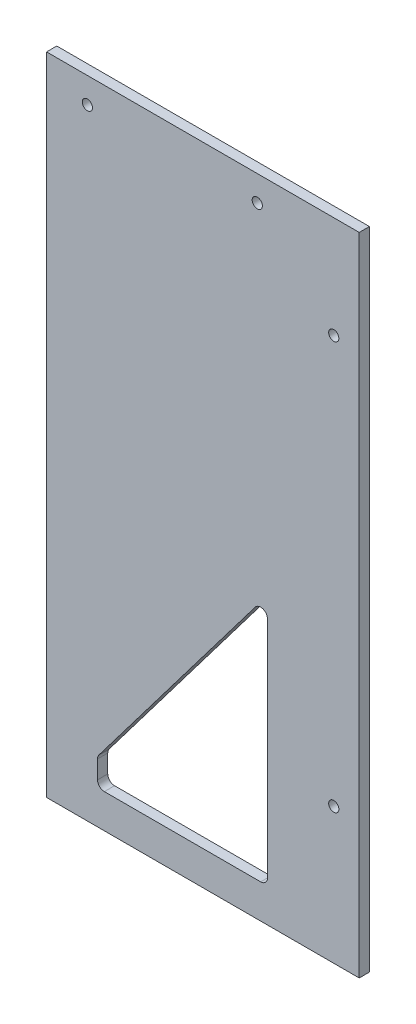
ISO-10303-21;
HEADER;
FILE_DESCRIPTION(('STEP AP214'),'2;1');
FILE_NAME('part.step','',(''),(''),'','','');
FILE_SCHEMA(('AUTOMOTIVE_DESIGN { 1 0 10303 214 1 1 1 1 }'));
ENDSEC;
DATA;
#1=APPLICATION_CONTEXT('core data for automotive mechanical design processes');
#2=APPLICATION_PROTOCOL_DEFINITION('international standard','automotive_design',2000,#1);
#3=PRODUCT_CONTEXT('',#1,'mechanical');
#4=PRODUCT('Part','Part','',(#3));
#5=PRODUCT_RELATED_PRODUCT_CATEGORY('part','',(#4));
#6=PRODUCT_DEFINITION_FORMATION('','',#4);
#7=PRODUCT_DEFINITION_CONTEXT('part definition',#1,'design');
#8=PRODUCT_DEFINITION('design','',#6,#7);
#9=PRODUCT_DEFINITION_SHAPE('','',#8);
#10=(LENGTH_UNIT() NAMED_UNIT(*) SI_UNIT(.MILLI.,.METRE.));
#11=(NAMED_UNIT(*) PLANE_ANGLE_UNIT() SI_UNIT($,.RADIAN.));
#12=(NAMED_UNIT(*) SI_UNIT($,.STERADIAN.) SOLID_ANGLE_UNIT());
#13=UNCERTAINTY_MEASURE_WITH_UNIT(LENGTH_MEASURE(1.E-05),#10,'distance_accuracy_value','');
#14=(GEOMETRIC_REPRESENTATION_CONTEXT(3) GLOBAL_UNCERTAINTY_ASSIGNED_CONTEXT((#13)) GLOBAL_UNIT_ASSIGNED_CONTEXT((#10,
#11,#12)) REPRESENTATION_CONTEXT('',''));
#15=CARTESIAN_POINT('',(0.,0.,0.));
#16=DIRECTION('',(0.,0.,1.));
#17=DIRECTION('',(1.,0.,0.));
#18=AXIS2_PLACEMENT_3D('',#15,#16,#17);
#19=CARTESIAN_POINT('',(0.,0.,3.));
#20=DIRECTION('',(0.,0.,1.));
#21=DIRECTION('',(1.,0.,0.));
#22=AXIS2_PLACEMENT_3D('',#19,#20,#21);
#23=PLANE('',#22);
#24=CARTESIAN_POINT('',(-34.,87.5,3.));
#25=DIRECTION('',(0.,0.,1.));
#26=DIRECTION('',(1.,0.,0.));
#27=AXIS2_PLACEMENT_3D('',#24,#25,#26);
#28=CIRCLE('',#27,1.5);
#29=CARTESIAN_POINT('',(-32.5,87.5,3.));
#30=VERTEX_POINT('',#29);
#31=EDGE_CURVE('E283',#30,#30,#28,.T.);
#32=ORIENTED_EDGE('',*,*,#31,.F.);
#33=EDGE_LOOP('',(#32));
#34=FACE_BOUND('',#33,.T.);
#35=CARTESIAN_POINT('',(16.,87.5,3.));
#36=DIRECTION('',(0.,0.,1.));
#37=DIRECTION('',(1.,0.,0.));
#38=AXIS2_PLACEMENT_3D('',#35,#36,#37);
#39=CIRCLE('',#38,1.5);
#40=CARTESIAN_POINT('',(17.5,87.5,3.));
#41=VERTEX_POINT('',#40);
#42=EDGE_CURVE('E291',#41,#41,#39,.T.);
#43=ORIENTED_EDGE('',*,*,#42,.F.);
#44=EDGE_LOOP('',(#43));
#45=FACE_BOUND('',#44,.T.);
#46=CARTESIAN_POINT('',(38.5,65.,3.));
#47=DIRECTION('',(0.,0.,1.));
#48=DIRECTION('',(1.,0.,0.));
#49=AXIS2_PLACEMENT_3D('',#46,#47,#48);
#50=CIRCLE('',#49,1.5);
#51=CARTESIAN_POINT('',(40.,65.,3.));
#52=VERTEX_POINT('',#51);
#53=EDGE_CURVE('E299',#52,#52,#50,.T.);
#54=ORIENTED_EDGE('',*,*,#53,.F.);
#55=EDGE_LOOP('',(#54));
#56=FACE_BOUND('',#55,.T.);
#57=CARTESIAN_POINT('',(38.5,-55.,3.));
#58=DIRECTION('',(0.,0.,1.));
#59=DIRECTION('',(1.,0.,0.));
#60=AXIS2_PLACEMENT_3D('',#57,#58,#59);
#61=CIRCLE('',#60,1.5);
#62=CARTESIAN_POINT('',(40.,-55.,3.));
#63=VERTEX_POINT('',#62);
#64=EDGE_CURVE('E253',#63,#63,#61,.T.);
#65=ORIENTED_EDGE('',*,*,#64,.F.);
#66=EDGE_LOOP('',(#65));
#67=FACE_BOUND('',#66,.T.);
#68=DIRECTION('',(0.,1.,0.));
#69=VECTOR('',#68,1.);
#70=CARTESIAN_POINT('',(46.,95.,3.));
#71=LINE('',#70,#69);
#72=CARTESIAN_POINT('',(46.,-95.,3.));
#73=VERTEX_POINT('',#72);
#74=CARTESIAN_POINT('',(46.,95.,3.));
#75=VERTEX_POINT('',#74);
#76=EDGE_CURVE('E153',#73,#75,#71,.T.);
#77=ORIENTED_EDGE('',*,*,#76,.T.);
#78=DIRECTION('',(-1.,0.,0.));
#79=VECTOR('',#78,1.);
#80=CARTESIAN_POINT('',(-46.,95.,3.));
#81=LINE('',#80,#79);
#82=CARTESIAN_POINT('',(-46.,95.,3.));
#83=VERTEX_POINT('',#82);
#84=EDGE_CURVE('E141',#75,#83,#81,.T.);
#85=ORIENTED_EDGE('',*,*,#84,.T.);
#86=DIRECTION('',(0.,-1.,0.));
#87=VECTOR('',#86,1.);
#88=CARTESIAN_POINT('',(-46.,95.,3.));
#89=LINE('',#88,#87);
#90=CARTESIAN_POINT('',(-46.,-95.,3.));
#91=VERTEX_POINT('',#90);
#92=EDGE_CURVE('E152',#83,#91,#89,.T.);
#93=ORIENTED_EDGE('',*,*,#92,.T.);
#94=DIRECTION('',(1.,0.,0.));
#95=VECTOR('',#94,1.);
#96=CARTESIAN_POINT('',(-46.,-95.,3.));
#97=LINE('',#96,#95);
#98=EDGE_CURVE('E158',#91,#73,#97,.T.);
#99=ORIENTED_EDGE('',*,*,#98,.T.);
#100=EDGE_LOOP('',(#77,#85,#93,#99));
#101=FACE_BOUND('',#100,.T.);
#102=DIRECTION('',(0.,-1.,0.));
#103=VECTOR('',#102,1.);
#104=CARTESIAN_POINT('',(-31.,0.,3.));
#105=LINE('',#104,#103);
#106=CARTESIAN_POINT('',(-31.,-77.6723841817379,3.));
#107=VERTEX_POINT('',#106);
#108=CARTESIAN_POINT('',(-31.,-83.,3.));
#109=VERTEX_POINT('',#108);
#110=EDGE_CURVE('E269',#107,#109,#105,.T.);
#111=ORIENTED_EDGE('',*,*,#110,.F.);
#112=CARTESIAN_POINT('',(-29.,-77.6723841817379,3.));
#113=DIRECTION('',(0.,0.,1.));
#114=DIRECTION('',(1.,0.,0.));
#115=AXIS2_PLACEMENT_3D('',#112,#113,#114);
#116=CIRCLE('',#115,2.);
#117=CARTESIAN_POINT('',(-30.593809269054,-76.4641739293905,3.));
#118=VERTEX_POINT('',#117);
#119=EDGE_CURVE('E221',#107,#118,#116,.F.);
#120=ORIENTED_EDGE('',*,*,#119,.T.);
#121=DIRECTION('',(0.60410512617371,0.796904634527022,0.));
#122=VECTOR('',#121,1.);
#123=CARTESIAN_POINT('',(17.3821245663307,-13.1767718486701,3.));
#124=LINE('',#123,#122);
#125=CARTESIAN_POINT('',(15.3997722880698,-15.7917897476526,3.));
#126=VERTEX_POINT('',#125);
#127=EDGE_CURVE('E265',#118,#126,#124,.T.);
#128=ORIENTED_EDGE('',*,*,#127,.T.);
#129=CARTESIAN_POINT('',(16.9935815571238,-17.,3.));
#130=DIRECTION('',(0.,0.,1.));
#131=DIRECTION('',(1.,0.,0.));
#132=AXIS2_PLACEMENT_3D('',#129,#130,#131);
#133=CIRCLE('',#132,2.);
#134=CARTESIAN_POINT('',(16.9935815571238,-15.,3.));
#135=VERTEX_POINT('',#134);
#136=EDGE_CURVE('E227',#126,#135,#133,.F.);
#137=ORIENTED_EDGE('',*,*,#136,.T.);
#138=DIRECTION('',(1.,0.,0.));
#139=VECTOR('',#138,1.);
#140=CARTESIAN_POINT('',(0.,-15.,3.));
#141=LINE('',#140,#139);
#142=CARTESIAN_POINT('',(17.,-15.,3.));
#143=VERTEX_POINT('',#142);
#144=EDGE_CURVE('E238',#135,#143,#141,.T.);
#145=ORIENTED_EDGE('',*,*,#144,.T.);
#146=CARTESIAN_POINT('',(17.,-17.,3.));
#147=DIRECTION('',(0.,0.,1.));
#148=DIRECTION('',(1.,0.,0.));
#149=AXIS2_PLACEMENT_3D('',#146,#147,#148);
#150=CIRCLE('',#149,2.);
#151=CARTESIAN_POINT('',(19.,-17.,3.));
#152=VERTEX_POINT('',#151);
#153=EDGE_CURVE('E48',#143,#152,#150,.F.);
#154=ORIENTED_EDGE('',*,*,#153,.T.);
#155=DIRECTION('',(0.,-1.,0.));
#156=VECTOR('',#155,1.);
#157=CARTESIAN_POINT('',(19.,0.,3.));
#158=LINE('',#157,#156);
#159=CARTESIAN_POINT('',(19.,-83.,3.));
#160=VERTEX_POINT('',#159);
#161=EDGE_CURVE('E237',#152,#160,#158,.T.);
#162=ORIENTED_EDGE('',*,*,#161,.T.);
#163=CARTESIAN_POINT('',(17.,-83.,3.));
#164=DIRECTION('',(0.,0.,1.));
#165=DIRECTION('',(1.,0.,0.));
#166=AXIS2_PLACEMENT_3D('',#163,#164,#165);
#167=CIRCLE('',#166,2.);
#168=CARTESIAN_POINT('',(17.,-85.,3.));
#169=VERTEX_POINT('',#168);
#170=EDGE_CURVE('E209',#160,#169,#167,.F.);
#171=ORIENTED_EDGE('',*,*,#170,.T.);
#172=DIRECTION('',(1.,0.,0.));
#173=VECTOR('',#172,1.);
#174=CARTESIAN_POINT('',(0.,-85.,3.));
#175=LINE('',#174,#173);
#176=CARTESIAN_POINT('',(-29.,-85.,3.));
#177=VERTEX_POINT('',#176);
#178=EDGE_CURVE('E247',#177,#169,#175,.T.);
#179=ORIENTED_EDGE('',*,*,#178,.F.);
#180=CARTESIAN_POINT('',(-29.,-83.,3.));
#181=DIRECTION('',(0.,0.,1.));
#182=DIRECTION('',(1.,0.,0.));
#183=AXIS2_PLACEMENT_3D('',#180,#181,#182);
#184=CIRCLE('',#183,2.);
#185=EDGE_CURVE('E215',#177,#109,#184,.F.);
#186=ORIENTED_EDGE('',*,*,#185,.T.);
#187=EDGE_LOOP('',(#111,#120,#128,#137,#145,#154,#162,#171,#179,#186));
#188=FACE_BOUND('',#187,.T.);
#189=ADVANCED_FACE('F39',(#34,#45,#56,#67,#101,#188),#23,.T.);
#190=CARTESIAN_POINT('',(0.,0.,0.));
#191=DIRECTION('',(0.,0.,1.));
#192=DIRECTION('',(1.,0.,0.));
#193=AXIS2_PLACEMENT_3D('',#190,#191,#192);
#194=PLANE('',#193);
#195=DIRECTION('',(0.,1.,0.));
#196=VECTOR('',#195,1.);
#197=CARTESIAN_POINT('',(46.,95.,0.));
#198=LINE('',#197,#196);
#199=CARTESIAN_POINT('',(46.,-95.,0.));
#200=VERTEX_POINT('',#199);
#201=CARTESIAN_POINT('',(46.,95.,0.));
#202=VERTEX_POINT('',#201);
#203=EDGE_CURVE('E167',#200,#202,#198,.T.);
#204=ORIENTED_EDGE('',*,*,#203,.F.);
#205=DIRECTION('',(1.,0.,0.));
#206=VECTOR('',#205,1.);
#207=CARTESIAN_POINT('',(-46.,-95.,0.));
#208=LINE('',#207,#206);
#209=CARTESIAN_POINT('',(-46.,-95.,0.));
#210=VERTEX_POINT('',#209);
#211=EDGE_CURVE('E163',#210,#200,#208,.T.);
#212=ORIENTED_EDGE('',*,*,#211,.F.);
#213=DIRECTION('',(0.,-1.,0.));
#214=VECTOR('',#213,1.);
#215=CARTESIAN_POINT('',(-46.,95.,0.));
#216=LINE('',#215,#214);
#217=CARTESIAN_POINT('',(-46.,95.,0.));
#218=VERTEX_POINT('',#217);
#219=EDGE_CURVE('E316',#218,#210,#216,.T.);
#220=ORIENTED_EDGE('',*,*,#219,.F.);
#221=DIRECTION('',(-1.,0.,0.));
#222=VECTOR('',#221,1.);
#223=CARTESIAN_POINT('',(-46.,95.,0.));
#224=LINE('',#223,#222);
#225=EDGE_CURVE('E313',#202,#218,#224,.T.);
#226=ORIENTED_EDGE('',*,*,#225,.F.);
#227=EDGE_LOOP('',(#204,#212,#220,#226));
#228=FACE_BOUND('',#227,.T.);
#229=CARTESIAN_POINT('',(38.5,-55.,0.));
#230=DIRECTION('',(0.,0.,1.));
#231=DIRECTION('',(1.,0.,0.));
#232=AXIS2_PLACEMENT_3D('',#229,#230,#231);
#233=CIRCLE('',#232,1.5);
#234=CARTESIAN_POINT('',(40.,-55.,0.));
#235=VERTEX_POINT('',#234);
#236=EDGE_CURVE('E259',#235,#235,#233,.T.);
#237=ORIENTED_EDGE('',*,*,#236,.T.);
#238=EDGE_LOOP('',(#237));
#239=FACE_BOUND('',#238,.T.);
#240=CARTESIAN_POINT('',(38.5,65.,0.));
#241=DIRECTION('',(0.,0.,1.));
#242=DIRECTION('',(1.,0.,0.));
#243=AXIS2_PLACEMENT_3D('',#240,#241,#242);
#244=CIRCLE('',#243,1.5);
#245=CARTESIAN_POINT('',(40.,65.,0.));
#246=VERTEX_POINT('',#245);
#247=EDGE_CURVE('E295',#246,#246,#244,.T.);
#248=ORIENTED_EDGE('',*,*,#247,.T.);
#249=EDGE_LOOP('',(#248));
#250=FACE_BOUND('',#249,.T.);
#251=CARTESIAN_POINT('',(16.,87.5,0.));
#252=DIRECTION('',(0.,0.,1.));
#253=DIRECTION('',(1.,0.,0.));
#254=AXIS2_PLACEMENT_3D('',#251,#252,#253);
#255=CIRCLE('',#254,1.5);
#256=CARTESIAN_POINT('',(17.5,87.5,0.));
#257=VERTEX_POINT('',#256);
#258=EDGE_CURVE('E287',#257,#257,#255,.T.);
#259=ORIENTED_EDGE('',*,*,#258,.T.);
#260=EDGE_LOOP('',(#259));
#261=FACE_BOUND('',#260,.T.);
#262=CARTESIAN_POINT('',(-34.,87.5,0.));
#263=DIRECTION('',(0.,0.,1.));
#264=DIRECTION('',(1.,0.,0.));
#265=AXIS2_PLACEMENT_3D('',#262,#263,#264);
#266=CIRCLE('',#265,1.5);
#267=CARTESIAN_POINT('',(-32.5,87.5,0.));
#268=VERTEX_POINT('',#267);
#269=EDGE_CURVE('E279',#268,#268,#266,.T.);
#270=ORIENTED_EDGE('',*,*,#269,.T.);
#271=EDGE_LOOP('',(#270));
#272=FACE_BOUND('',#271,.T.);
#273=DIRECTION('',(0.60410512617371,0.796904634527022,0.));
#274=VECTOR('',#273,1.);
#275=CARTESIAN_POINT('',(17.3821245663307,-13.1767718486701,0.));
#276=LINE('',#275,#274);
#277=CARTESIAN_POINT('',(-30.593809269054,-76.4641739293905,0.));
#278=VERTEX_POINT('',#277);
#279=CARTESIAN_POINT('',(15.3997722880698,-15.7917897476526,0.));
#280=VERTEX_POINT('',#279);
#281=EDGE_CURVE('E278',#278,#280,#276,.T.);
#282=ORIENTED_EDGE('',*,*,#281,.F.);
#283=CARTESIAN_POINT('',(-29.,-77.6723841817379,0.));
#284=DIRECTION('',(0.,0.,1.));
#285=DIRECTION('',(1.,0.,0.));
#286=AXIS2_PLACEMENT_3D('',#283,#284,#285);
#287=CIRCLE('',#286,2.);
#288=CARTESIAN_POINT('',(-31.,-77.6723841817379,0.));
#289=VERTEX_POINT('',#288);
#290=EDGE_CURVE('E224',#278,#289,#287,.T.);
#291=ORIENTED_EDGE('',*,*,#290,.T.);
#292=DIRECTION('',(0.,-1.,0.));
#293=VECTOR('',#292,1.);
#294=CARTESIAN_POINT('',(-31.,0.,0.));
#295=LINE('',#294,#293);
#296=CARTESIAN_POINT('',(-31.,-83.,0.));
#297=VERTEX_POINT('',#296);
#298=EDGE_CURVE('E524',#289,#297,#295,.T.);
#299=ORIENTED_EDGE('',*,*,#298,.T.);
#300=CARTESIAN_POINT('',(-29.,-83.,0.));
#301=DIRECTION('',(0.,0.,1.));
#302=DIRECTION('',(1.,0.,0.));
#303=AXIS2_PLACEMENT_3D('',#300,#301,#302);
#304=CIRCLE('',#303,2.);
#305=CARTESIAN_POINT('',(-29.,-85.,0.));
#306=VERTEX_POINT('',#305);
#307=EDGE_CURVE('E218',#297,#306,#304,.T.);
#308=ORIENTED_EDGE('',*,*,#307,.T.);
#309=DIRECTION('',(1.,0.,0.));
#310=VECTOR('',#309,1.);
#311=CARTESIAN_POINT('',(0.,-85.,0.));
#312=LINE('',#311,#310);
#313=CARTESIAN_POINT('',(17.,-85.,0.));
#314=VERTEX_POINT('',#313);
#315=EDGE_CURVE('E261',#306,#314,#312,.T.);
#316=ORIENTED_EDGE('',*,*,#315,.T.);
#317=CARTESIAN_POINT('',(17.,-83.,0.));
#318=DIRECTION('',(0.,0.,1.));
#319=DIRECTION('',(1.,0.,0.));
#320=AXIS2_PLACEMENT_3D('',#317,#318,#319);
#321=CIRCLE('',#320,2.);
#322=CARTESIAN_POINT('',(19.,-83.,0.));
#323=VERTEX_POINT('',#322);
#324=EDGE_CURVE('E212',#314,#323,#321,.T.);
#325=ORIENTED_EDGE('',*,*,#324,.T.);
#326=DIRECTION('',(0.,-1.,0.));
#327=VECTOR('',#326,1.);
#328=CARTESIAN_POINT('',(19.,0.,0.));
#329=LINE('',#328,#327);
#330=CARTESIAN_POINT('',(19.,-17.,0.));
#331=VERTEX_POINT('',#330);
#332=EDGE_CURVE('E254',#331,#323,#329,.T.);
#333=ORIENTED_EDGE('',*,*,#332,.F.);
#334=CARTESIAN_POINT('',(17.,-17.,0.));
#335=DIRECTION('',(0.,0.,1.));
#336=DIRECTION('',(1.,0.,0.));
#337=AXIS2_PLACEMENT_3D('',#334,#335,#336);
#338=CIRCLE('',#337,2.);
#339=CARTESIAN_POINT('',(17.,-15.,0.));
#340=VERTEX_POINT('',#339);
#341=EDGE_CURVE('E11',#331,#340,#338,.T.);
#342=ORIENTED_EDGE('',*,*,#341,.T.);
#343=DIRECTION('',(1.,0.,0.));
#344=VECTOR('',#343,1.);
#345=CARTESIAN_POINT('',(0.,-15.,0.));
#346=LINE('',#345,#344);
#347=CARTESIAN_POINT('',(16.9935815571238,-15.,0.));
#348=VERTEX_POINT('',#347);
#349=EDGE_CURVE('E250',#348,#340,#346,.T.);
#350=ORIENTED_EDGE('',*,*,#349,.F.);
#351=CARTESIAN_POINT('',(16.9935815571238,-17.,0.));
#352=DIRECTION('',(0.,0.,1.));
#353=DIRECTION('',(1.,0.,0.));
#354=AXIS2_PLACEMENT_3D('',#351,#352,#353);
#355=CIRCLE('',#354,2.);
#356=EDGE_CURVE('E230',#348,#280,#355,.T.);
#357=ORIENTED_EDGE('',*,*,#356,.T.);
#358=EDGE_LOOP('',(#282,#291,#299,#308,#316,#325,#333,#342,#350,#357));
#359=FACE_BOUND('',#358,.T.);
#360=ADVANCED_FACE('F331',(#228,#239,#250,#261,#272,#359),#194,.F.);
#361=CARTESIAN_POINT('',(46.,95.,3.));
#362=DIRECTION('',(-1.,0.,0.));
#363=DIRECTION('',(0.,-1.,0.));
#364=AXIS2_PLACEMENT_3D('',#361,#362,#363);
#365=PLANE('',#364);
#366=ORIENTED_EDGE('',*,*,#203,.T.);
#367=DIRECTION('',(0.,0.,-1.));
#368=VECTOR('',#367,1.);
#369=CARTESIAN_POINT('',(46.,95.,3.));
#370=LINE('',#369,#368);
#371=EDGE_CURVE('E145',#75,#202,#370,.T.);
#372=ORIENTED_EDGE('',*,*,#371,.F.);
#373=ORIENTED_EDGE('',*,*,#76,.F.);
#374=DIRECTION('',(0.,0.,-1.));
#375=VECTOR('',#374,1.);
#376=CARTESIAN_POINT('',(46.,-95.,3.));
#377=LINE('',#376,#375);
#378=EDGE_CURVE('E310',#73,#200,#377,.T.);
#379=ORIENTED_EDGE('',*,*,#378,.T.);
#380=EDGE_LOOP('',(#366,#372,#373,#379));
#381=FACE_BOUND('',#380,.T.);
#382=ADVANCED_FACE('F165',(#381),#365,.F.);
#383=CARTESIAN_POINT('',(-46.,95.,3.));
#384=DIRECTION('',(0.,-1.,0.));
#385=DIRECTION('',(0.,0.,-1.));
#386=AXIS2_PLACEMENT_3D('',#383,#384,#385);
#387=PLANE('',#386);
#388=ORIENTED_EDGE('',*,*,#225,.T.);
#389=DIRECTION('',(0.,0.,-1.));
#390=VECTOR('',#389,1.);
#391=CARTESIAN_POINT('',(-46.,95.,3.));
#392=LINE('',#391,#390);
#393=EDGE_CURVE('E148',#83,#218,#392,.T.);
#394=ORIENTED_EDGE('',*,*,#393,.F.);
#395=ORIENTED_EDGE('',*,*,#84,.F.);
#396=ORIENTED_EDGE('',*,*,#371,.T.);
#397=EDGE_LOOP('',(#388,#394,#395,#396));
#398=FACE_BOUND('',#397,.T.);
#399=ADVANCED_FACE('F143',(#398),#387,.F.);
#400=CARTESIAN_POINT('',(-46.,95.,3.));
#401=DIRECTION('',(1.,0.,0.));
#402=DIRECTION('',(0.,1.,0.));
#403=AXIS2_PLACEMENT_3D('',#400,#401,#402);
#404=PLANE('',#403);
#405=ORIENTED_EDGE('',*,*,#219,.T.);
#406=DIRECTION('',(0.,0.,-1.));
#407=VECTOR('',#406,1.);
#408=CARTESIAN_POINT('',(-46.,-95.,3.));
#409=LINE('',#408,#407);
#410=EDGE_CURVE('E175',#91,#210,#409,.T.);
#411=ORIENTED_EDGE('',*,*,#410,.F.);
#412=ORIENTED_EDGE('',*,*,#92,.F.);
#413=ORIENTED_EDGE('',*,*,#393,.T.);
#414=EDGE_LOOP('',(#405,#411,#412,#413));
#415=FACE_BOUND('',#414,.T.);
#416=ADVANCED_FACE('F333',(#415),#404,.F.);
#417=CARTESIAN_POINT('',(-46.,-95.,3.));
#418=DIRECTION('',(0.,1.,0.));
#419=DIRECTION('',(0.,0.,1.));
#420=AXIS2_PLACEMENT_3D('',#417,#418,#419);
#421=PLANE('',#420);
#422=ORIENTED_EDGE('',*,*,#211,.T.);
#423=ORIENTED_EDGE('',*,*,#378,.F.);
#424=ORIENTED_EDGE('',*,*,#98,.F.);
#425=ORIENTED_EDGE('',*,*,#410,.T.);
#426=EDGE_LOOP('',(#422,#423,#424,#425));
#427=FACE_BOUND('',#426,.T.);
#428=ADVANCED_FACE('F327',(#427),#421,.F.);
#429=CARTESIAN_POINT('',(38.5,-55.,0.));
#430=DIRECTION('',(0.,0.,1.));
#431=DIRECTION('',(1.,0.,0.));
#432=AXIS2_PLACEMENT_3D('',#429,#430,#431);
#433=CYLINDRICAL_SURFACE('',#432,1.5);
#434=ORIENTED_EDGE('',*,*,#236,.F.);
#435=EDGE_LOOP('',(#434));
#436=FACE_BOUND('',#435,.T.);
#437=ORIENTED_EDGE('',*,*,#64,.T.);
#438=EDGE_LOOP('',(#437));
#439=FACE_BOUND('',#438,.T.);
#440=ADVANCED_FACE('F340',(#436,#439),#433,.F.);
#441=CARTESIAN_POINT('',(38.5,65.,0.));
#442=DIRECTION('',(0.,0.,1.));
#443=DIRECTION('',(1.,0.,0.));
#444=AXIS2_PLACEMENT_3D('',#441,#442,#443);
#445=CYLINDRICAL_SURFACE('',#444,1.5);
#446=ORIENTED_EDGE('',*,*,#247,.F.);
#447=EDGE_LOOP('',(#446));
#448=FACE_BOUND('',#447,.T.);
#449=ORIENTED_EDGE('',*,*,#53,.T.);
#450=EDGE_LOOP('',(#449));
#451=FACE_BOUND('',#450,.T.);
#452=ADVANCED_FACE('F355',(#448,#451),#445,.F.);
#453=CARTESIAN_POINT('',(16.,87.5,0.));
#454=DIRECTION('',(0.,0.,1.));
#455=DIRECTION('',(1.,0.,0.));
#456=AXIS2_PLACEMENT_3D('',#453,#454,#455);
#457=CYLINDRICAL_SURFACE('',#456,1.5);
#458=ORIENTED_EDGE('',*,*,#258,.F.);
#459=EDGE_LOOP('',(#458));
#460=FACE_BOUND('',#459,.T.);
#461=ORIENTED_EDGE('',*,*,#42,.T.);
#462=EDGE_LOOP('',(#461));
#463=FACE_BOUND('',#462,.T.);
#464=ADVANCED_FACE('F359',(#460,#463),#457,.F.);
#465=CARTESIAN_POINT('',(-34.,87.5,0.));
#466=DIRECTION('',(0.,0.,1.));
#467=DIRECTION('',(1.,0.,0.));
#468=AXIS2_PLACEMENT_3D('',#465,#466,#467);
#469=CYLINDRICAL_SURFACE('',#468,1.5);
#470=ORIENTED_EDGE('',*,*,#269,.F.);
#471=EDGE_LOOP('',(#470));
#472=FACE_BOUND('',#471,.T.);
#473=ORIENTED_EDGE('',*,*,#31,.T.);
#474=EDGE_LOOP('',(#473));
#475=FACE_BOUND('',#474,.T.);
#476=ADVANCED_FACE('F363',(#472,#475),#469,.F.);
#477=CARTESIAN_POINT('',(17.3821245663307,-13.1767718486701,0.));
#478=DIRECTION('',(0.796904634527022,-0.60410512617371,0.));
#479=DIRECTION('',(0.60410512617371,0.796904634527022,0.));
#480=AXIS2_PLACEMENT_3D('',#477,#478,#479);
#481=PLANE('',#480);
#482=ORIENTED_EDGE('',*,*,#127,.F.);
#483=DIRECTION('',(0.,0.,1.));
#484=VECTOR('',#483,1.);
#485=CARTESIAN_POINT('',(-30.593809269054,-76.4641739293905,0.));
#486=LINE('',#485,#484);
#487=EDGE_CURVE('E200',#118,#278,#486,.F.);
#488=ORIENTED_EDGE('',*,*,#487,.T.);
#489=ORIENTED_EDGE('',*,*,#281,.T.);
#490=DIRECTION('',(0.,0.,1.));
#491=VECTOR('',#490,1.);
#492=CARTESIAN_POINT('',(15.3997722880698,-15.7917897476526,3.));
#493=LINE('',#492,#491);
#494=EDGE_CURVE('E196',#280,#126,#493,.T.);
#495=ORIENTED_EDGE('',*,*,#494,.T.);
#496=EDGE_LOOP('',(#482,#488,#489,#495));
#497=FACE_BOUND('',#496,.T.);
#498=ADVANCED_FACE('F367',(#497),#481,.T.);
#499=CARTESIAN_POINT('',(0.,-15.,0.));
#500=DIRECTION('',(0.,-1.,0.));
#501=DIRECTION('',(0.,0.,-1.));
#502=AXIS2_PLACEMENT_3D('',#499,#500,#501);
#503=PLANE('',#502);
#504=ORIENTED_EDGE('',*,*,#144,.F.);
#505=DIRECTION('',(0.,0.,1.));
#506=VECTOR('',#505,1.);
#507=CARTESIAN_POINT('',(16.9935815571238,-15.,0.));
#508=LINE('',#507,#506);
#509=EDGE_CURVE('E60',#135,#348,#508,.F.);
#510=ORIENTED_EDGE('',*,*,#509,.T.);
#511=ORIENTED_EDGE('',*,*,#349,.T.);
#512=DIRECTION('',(0.,0.,1.));
#513=VECTOR('',#512,1.);
#514=CARTESIAN_POINT('',(17.,-15.,3.));
#515=LINE('',#514,#513);
#516=EDGE_CURVE('E203',#340,#143,#515,.T.);
#517=ORIENTED_EDGE('',*,*,#516,.T.);
#518=EDGE_LOOP('',(#504,#510,#511,#517));
#519=FACE_BOUND('',#518,.T.);
#520=ADVANCED_FACE('F249',(#519),#503,.T.);
#521=CARTESIAN_POINT('',(19.,0.,0.));
#522=DIRECTION('',(-1.,0.,0.));
#523=DIRECTION('',(0.,-1.,0.));
#524=AXIS2_PLACEMENT_3D('',#521,#522,#523);
#525=PLANE('',#524);
#526=ORIENTED_EDGE('',*,*,#332,.T.);
#527=DIRECTION('',(0.,0.,1.));
#528=VECTOR('',#527,1.);
#529=CARTESIAN_POINT('',(19.,-83.,0.));
#530=LINE('',#529,#528);
#531=EDGE_CURVE('E173',#323,#160,#530,.T.);
#532=ORIENTED_EDGE('',*,*,#531,.T.);
#533=ORIENTED_EDGE('',*,*,#161,.F.);
#534=DIRECTION('',(0.,0.,1.));
#535=VECTOR('',#534,1.);
#536=CARTESIAN_POINT('',(19.,-17.,0.));
#537=LINE('',#536,#535);
#538=EDGE_CURVE('E169',#152,#331,#537,.F.);
#539=ORIENTED_EDGE('',*,*,#538,.T.);
#540=EDGE_LOOP('',(#526,#532,#533,#539));
#541=FACE_BOUND('',#540,.T.);
#542=ADVANCED_FACE('F244',(#541),#525,.T.);
#543=CARTESIAN_POINT('',(0.,-85.,0.));
#544=DIRECTION('',(0.,-1.,0.));
#545=DIRECTION('',(0.,0.,-1.));
#546=AXIS2_PLACEMENT_3D('',#543,#544,#545);
#547=PLANE('',#546);
#548=ORIENTED_EDGE('',*,*,#178,.T.);
#549=DIRECTION('',(0.,0.,1.));
#550=VECTOR('',#549,1.);
#551=CARTESIAN_POINT('',(17.,-85.,0.));
#552=LINE('',#551,#550);
#553=EDGE_CURVE('E186',#169,#314,#552,.F.);
#554=ORIENTED_EDGE('',*,*,#553,.T.);
#555=ORIENTED_EDGE('',*,*,#315,.F.);
#556=DIRECTION('',(0.,0.,1.));
#557=VECTOR('',#556,1.);
#558=CARTESIAN_POINT('',(-29.,-85.,3.));
#559=LINE('',#558,#557);
#560=EDGE_CURVE('E182',#306,#177,#559,.T.);
#561=ORIENTED_EDGE('',*,*,#560,.T.);
#562=EDGE_LOOP('',(#548,#554,#555,#561));
#563=FACE_BOUND('',#562,.T.);
#564=ADVANCED_FACE('F376',(#563),#547,.F.);
#565=CARTESIAN_POINT('',(-31.,0.,0.));
#566=DIRECTION('',(-1.,0.,0.));
#567=DIRECTION('',(0.,-1.,0.));
#568=AXIS2_PLACEMENT_3D('',#565,#566,#567);
#569=PLANE('',#568);
#570=ORIENTED_EDGE('',*,*,#110,.T.);
#571=DIRECTION('',(0.,0.,1.));
#572=VECTOR('',#571,1.);
#573=CARTESIAN_POINT('',(-31.,-83.,0.));
#574=LINE('',#573,#572);
#575=EDGE_CURVE('E193',#109,#297,#574,.F.);
#576=ORIENTED_EDGE('',*,*,#575,.T.);
#577=ORIENTED_EDGE('',*,*,#298,.F.);
#578=DIRECTION('',(0.,0.,1.));
#579=VECTOR('',#578,1.);
#580=CARTESIAN_POINT('',(-31.,-77.6723841817379,0.));
#581=LINE('',#580,#579);
#582=EDGE_CURVE('E189',#289,#107,#581,.T.);
#583=ORIENTED_EDGE('',*,*,#582,.T.);
#584=EDGE_LOOP('',(#570,#576,#577,#583));
#585=FACE_BOUND('',#584,.T.);
#586=ADVANCED_FACE('F372',(#585),#569,.F.);
#587=CARTESIAN_POINT('',(17.,-83.,0.));
#588=DIRECTION('',(0.,0.,1.));
#589=DIRECTION('',(1.,0.,0.));
#590=AXIS2_PLACEMENT_3D('',#587,#588,#589);
#591=CYLINDRICAL_SURFACE('',#590,2.);
#592=ORIENTED_EDGE('',*,*,#324,.F.);
#593=ORIENTED_EDGE('',*,*,#553,.F.);
#594=ORIENTED_EDGE('',*,*,#170,.F.);
#595=ORIENTED_EDGE('',*,*,#531,.F.);
#596=EDGE_LOOP('',(#592,#593,#594,#595));
#597=FACE_BOUND('',#596,.T.);
#598=ADVANCED_FACE('F375',(#597),#591,.F.);
#599=CARTESIAN_POINT('',(-29.,-83.,0.));
#600=DIRECTION('',(0.,0.,-1.));
#601=DIRECTION('',(-1.,0.,0.));
#602=AXIS2_PLACEMENT_3D('',#599,#600,#601);
#603=CYLINDRICAL_SURFACE('',#602,2.);
#604=ORIENTED_EDGE('',*,*,#307,.F.);
#605=ORIENTED_EDGE('',*,*,#575,.F.);
#606=ORIENTED_EDGE('',*,*,#185,.F.);
#607=ORIENTED_EDGE('',*,*,#560,.F.);
#608=EDGE_LOOP('',(#604,#605,#606,#607));
#609=FACE_BOUND('',#608,.T.);
#610=ADVANCED_FACE('F406',(#609),#603,.F.);
#611=CARTESIAN_POINT('',(-29.,-77.6723841817379,0.));
#612=DIRECTION('',(0.,0.,1.));
#613=DIRECTION('',(1.,0.,0.));
#614=AXIS2_PLACEMENT_3D('',#611,#612,#613);
#615=CYLINDRICAL_SURFACE('',#614,2.);
#616=ORIENTED_EDGE('',*,*,#290,.F.);
#617=ORIENTED_EDGE('',*,*,#487,.F.);
#618=ORIENTED_EDGE('',*,*,#119,.F.);
#619=ORIENTED_EDGE('',*,*,#582,.F.);
#620=EDGE_LOOP('',(#616,#617,#618,#619));
#621=FACE_BOUND('',#620,.T.);
#622=ADVANCED_FACE('F414',(#621),#615,.F.);
#623=CARTESIAN_POINT('',(16.9935815571238,-17.,0.));
#624=DIRECTION('',(0.,0.,-1.));
#625=DIRECTION('',(-1.,0.,0.));
#626=AXIS2_PLACEMENT_3D('',#623,#624,#625);
#627=CYLINDRICAL_SURFACE('',#626,2.);
#628=ORIENTED_EDGE('',*,*,#356,.F.);
#629=ORIENTED_EDGE('',*,*,#509,.F.);
#630=ORIENTED_EDGE('',*,*,#136,.F.);
#631=ORIENTED_EDGE('',*,*,#494,.F.);
#632=EDGE_LOOP('',(#628,#629,#630,#631));
#633=FACE_BOUND('',#632,.T.);
#634=ADVANCED_FACE('F422',(#633),#627,.F.);
#635=CARTESIAN_POINT('',(17.,-17.,0.));
#636=DIRECTION('',(0.,0.,-1.));
#637=DIRECTION('',(-1.,0.,0.));
#638=AXIS2_PLACEMENT_3D('',#635,#636,#637);
#639=CYLINDRICAL_SURFACE('',#638,2.);
#640=ORIENTED_EDGE('',*,*,#341,.F.);
#641=ORIENTED_EDGE('',*,*,#538,.F.);
#642=ORIENTED_EDGE('',*,*,#153,.F.);
#643=ORIENTED_EDGE('',*,*,#516,.F.);
#644=EDGE_LOOP('',(#640,#641,#642,#643));
#645=FACE_BOUND('',#644,.T.);
#646=ADVANCED_FACE('F41',(#645),#639,.F.);
#647=CLOSED_SHELL('',(#189,#360,#382,#399,#416,#428,#440,#452,#464,#476,#498,#520,#542,#564,
#586,#598,#610,#622,#634,#646));
#648=MANIFOLD_SOLID_BREP('B2',#647);
#649=ADVANCED_BREP_SHAPE_REPRESENTATION('',(#18,#648),#14);
#650=SHAPE_DEFINITION_REPRESENTATION(#9,#649);
ENDSEC;
END-ISO-10303-21;
